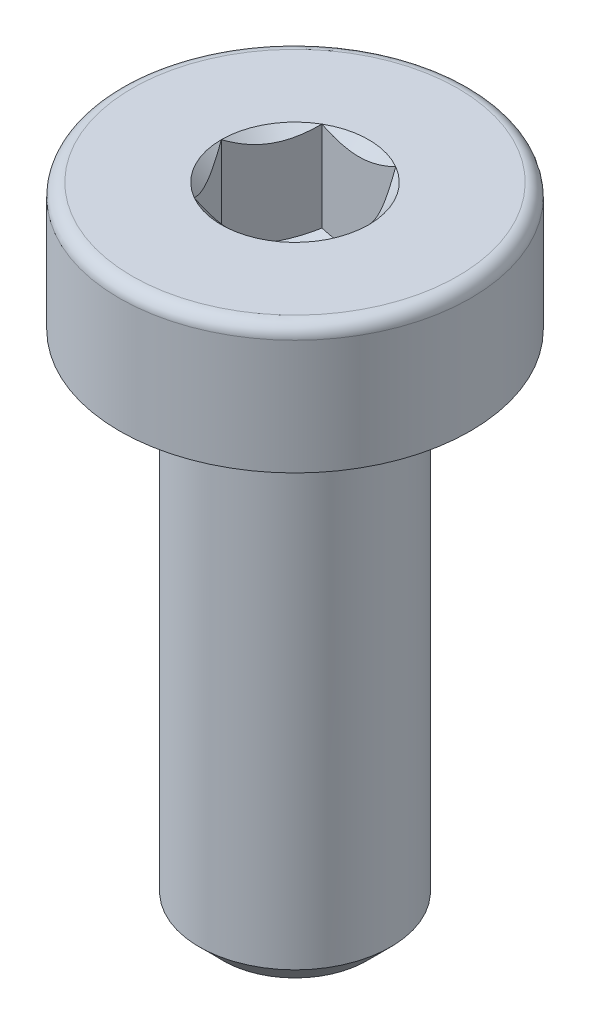
ISO-10303-21;
HEADER;
FILE_DESCRIPTION(('STEP AP214'),'2;1');
FILE_NAME('part.step','',(''),(''),'','','');
FILE_SCHEMA(('AUTOMOTIVE_DESIGN { 1 0 10303 214 1 1 1 1 }'));
ENDSEC;
DATA;
#1=APPLICATION_CONTEXT('core data for automotive mechanical design processes');
#2=APPLICATION_PROTOCOL_DEFINITION('international standard','automotive_design',2000,#1);
#3=PRODUCT_CONTEXT('',#1,'mechanical');
#4=PRODUCT('Part','Part','',(#3));
#5=PRODUCT_RELATED_PRODUCT_CATEGORY('part','',(#4));
#6=PRODUCT_DEFINITION_FORMATION('','',#4);
#7=PRODUCT_DEFINITION_CONTEXT('part definition',#1,'design');
#8=PRODUCT_DEFINITION('design','',#6,#7);
#9=PRODUCT_DEFINITION_SHAPE('','',#8);
#10=(LENGTH_UNIT() NAMED_UNIT(*) SI_UNIT(.MILLI.,.METRE.));
#11=(NAMED_UNIT(*) PLANE_ANGLE_UNIT() SI_UNIT($,.RADIAN.));
#12=(NAMED_UNIT(*) SI_UNIT($,.STERADIAN.) SOLID_ANGLE_UNIT());
#13=UNCERTAINTY_MEASURE_WITH_UNIT(LENGTH_MEASURE(1.E-05),#10,'distance_accuracy_value','');
#14=(GEOMETRIC_REPRESENTATION_CONTEXT(3) GLOBAL_UNCERTAINTY_ASSIGNED_CONTEXT((#13)) GLOBAL_UNIT_ASSIGNED_CONTEXT((#10,
#11,#12)) REPRESENTATION_CONTEXT('',''));
#15=CARTESIAN_POINT('',(0.,0.,0.));
#16=DIRECTION('',(0.,0.,1.));
#17=DIRECTION('',(1.,0.,0.));
#18=AXIS2_PLACEMENT_3D('',#15,#16,#17);
#19=CARTESIAN_POINT('',(0.,-0.2,0.));
#20=DIRECTION('',(0.,1.,0.));
#21=DIRECTION('',(0.,0.,-1.));
#22=AXIS2_PLACEMENT_3D('',#19,#20,#21);
#23=TOROIDAL_SURFACE('',#22,1.7,0.2);
#24=CARTESIAN_POINT('',(0.,0.,0.));
#25=DIRECTION('',(0.,-1.,0.));
#26=DIRECTION('',(0.,0.,-1.));
#27=AXIS2_PLACEMENT_3D('',#24,#25,#26);
#28=CIRCLE('',#27,1.7);
#29=CARTESIAN_POINT('',(0.,0.,-1.7));
#30=VERTEX_POINT('',#29);
#31=EDGE_CURVE('E127',#30,#30,#28,.T.);
#32=ORIENTED_EDGE('',*,*,#31,.T.);
#33=EDGE_LOOP('',(#32));
#34=FACE_BOUND('',#33,.T.);
#35=CARTESIAN_POINT('',(0.,-0.2,0.));
#36=DIRECTION('',(0.,1.,0.));
#37=DIRECTION('',(0.,0.,-1.));
#38=AXIS2_PLACEMENT_3D('',#35,#36,#37);
#39=CIRCLE('',#38,1.5);
#40=CARTESIAN_POINT('',(0.,-0.2,-1.5));
#41=VERTEX_POINT('',#40);
#42=EDGE_CURVE('E139',#41,#41,#39,.T.);
#43=ORIENTED_EDGE('',*,*,#42,.T.);
#44=EDGE_LOOP('',(#43));
#45=FACE_BOUND('',#44,.T.);
#46=ADVANCED_FACE('F41',(#34,#45),#23,.F.);
#47=CARTESIAN_POINT('',(0.,-8.,0.));
#48=DIRECTION('',(0.,1.,0.));
#49=DIRECTION('',(1.,0.,0.));
#50=AXIS2_PLACEMENT_3D('',#47,#48,#49);
#51=PLANE('',#50);
#52=CARTESIAN_POINT('',(0.,-8.,0.));
#53=DIRECTION('',(0.,1.,0.));
#54=DIRECTION('',(0.,0.,-1.));
#55=AXIS2_PLACEMENT_3D('',#52,#53,#54);
#56=CIRCLE('',#55,1.125);
#57=CARTESIAN_POINT('',(0.,-8.,-1.125));
#58=VERTEX_POINT('',#57);
#59=EDGE_CURVE('E11',#58,#58,#56,.T.);
#60=ORIENTED_EDGE('',*,*,#59,.F.);
#61=EDGE_LOOP('',(#60));
#62=FACE_BOUND('',#61,.T.);
#63=ADVANCED_FACE('F206',(#62),#51,.F.);
#64=CARTESIAN_POINT('',(0.,-8.125,0.));
#65=DIRECTION('',(0.,1.,0.));
#66=DIRECTION('',(-1.,0.,0.));
#67=AXIS2_PLACEMENT_3D('',#64,#65,#66);
#68=CONICAL_SURFACE('',#67,1.,0.785398163397448);
#69=ORIENTED_EDGE('',*,*,#59,.T.);
#70=EDGE_LOOP('',(#69));
#71=FACE_BOUND('',#70,.T.);
#72=CARTESIAN_POINT('',(0.,-7.625,0.));
#73=DIRECTION('',(0.,1.,0.));
#74=DIRECTION('',(-1.,0.,0.));
#75=AXIS2_PLACEMENT_3D('',#72,#73,#74);
#76=CIRCLE('',#75,1.5);
#77=CARTESIAN_POINT('',(-1.5,-7.625,0.));
#78=VERTEX_POINT('',#77);
#79=EDGE_CURVE('E142',#78,#78,#76,.T.);
#80=ORIENTED_EDGE('',*,*,#79,.F.);
#81=EDGE_LOOP('',(#80));
#82=FACE_BOUND('',#81,.T.);
#83=ADVANCED_FACE('F164',(#71,#82),#68,.T.);
#84=CARTESIAN_POINT('',(-1.15470053837925,0.5,0.));
#85=DIRECTION('',(-0.866025403784439,0.,-0.5));
#86=DIRECTION('',(0.,1.,0.));
#87=AXIS2_PLACEMENT_3D('',#84,#85,#86);
#88=PLANE('',#87);
#89=CARTESIAN_POINT('',(-1.15470053837925,2.,0.));
#90=CARTESIAN_POINT('',(-1.13811290051949,1.98342266199646,-0.0287348170953944));
#91=CARTESIAN_POINT('',(-1.12123555069305,1.96760439479917,-0.0577616138982867));
#92=CARTESIAN_POINT('',(-1.09593470093621,1.94579754194468,-0.101183953998303));
#93=CARTESIAN_POINT('',(-1.08770744910027,1.93899563963594,-0.115289976780325));
#94=CARTESIAN_POINT('',(-1.07137905760404,1.92611876946348,-0.143289328742409));
#95=CARTESIAN_POINT('',(-1.06328091933733,1.92002869586461,-0.157177412131507));
#96=CARTESIAN_POINT('',(-1.04720018701061,1.90857633773861,-0.184787164277924));
#97=CARTESIAN_POINT('',(-1.03921987610035,1.90319950581573,-0.198504111998951));
#98=CARTESIAN_POINT('',(-1.02335869013404,1.89317259824657,-0.225819419170297));
#99=CARTESIAN_POINT('',(-1.01547945146266,1.88850921181502,-0.239413822772958));
#100=CARTESIAN_POINT('',(-0.999798885932428,1.87990783588392,-0.266532275213475));
#101=CARTESIAN_POINT('',(-0.991998636338617,1.87595850190746,-0.280053335251351));
#102=CARTESIAN_POINT('',(-0.976448412405247,1.86878294697385,-0.307073372510779));
#103=CARTESIAN_POINT('',(-0.968699070566479,1.86554812543175,-0.320570421372709));
#104=CARTESIAN_POINT('',(-0.953216804871379,1.85979880306902,-0.347590357134202));
#105=CARTESIAN_POINT('',(-0.945484180860458,1.85727916970106,-0.361112320660297));
#106=CARTESIAN_POINT('',(-0.929993904585942,1.85295579242638,-0.388228510454098));
#107=CARTESIAN_POINT('',(-0.922236308144873,1.85115096744245,-0.401822595841889));
#108=CARTESIAN_POINT('',(-0.90665050966111,1.8482557150365,-0.429129644754855));
#109=CARTESIAN_POINT('',(-0.898822146976691,1.84716860492423,-0.442842867527506));
#110=CARTESIAN_POINT('',(-0.883030995902152,1.8456940799998,-0.470425755688464));
#111=CARTESIAN_POINT('',(-0.875067667178854,1.84531431420474,-0.484295517782133));
#112=CARTESIAN_POINT('',(-0.858942744760318,1.84528887087763,-0.51231125005588));
#113=CARTESIAN_POINT('',(-0.85078050857397,1.84565882739202,-0.52645688326507));
#114=CARTESIAN_POINT('',(-0.834496812685205,1.847210942197,-0.554713266474792));
#115=CARTESIAN_POINT('',(-0.826375327173013,1.84839249628394,-0.56882403459356));
#116=CARTESIAN_POINT('',(-0.810129363846157,1.85155142789717,-0.597074648783628));
#117=CARTESIAN_POINT('',(-0.802005196148906,1.85353382402747,-0.61121410805965));
#118=CARTESIAN_POINT('',(-0.785713974285288,1.85829144566636,-0.639587165283902));
#119=CARTESIAN_POINT('',(-0.777547766927851,1.86107677968836,-0.653819546505297));
#120=CARTESIAN_POINT('',(-0.761124224940597,1.86743549154836,-0.682436198086551));
#121=CARTESIAN_POINT('',(-0.752868210738168,1.87102315380283,-0.696818032238172));
#122=CARTESIAN_POINT('',(-0.736207806345465,1.87897968869029,-0.725784259598186));
#123=CARTESIAN_POINT('',(-0.727804874211313,1.88336586622526,-0.740364713591029));
#124=CARTESIAN_POINT('',(-0.711592080268563,1.8924866846744,-0.768416307208119));
#125=CARTESIAN_POINT('',(-0.703778742074904,1.89718094197276,-0.781898624581838));
#126=CARTESIAN_POINT('',(-0.688135072813054,1.90717702575227,-0.808872655482011));
#127=CARTESIAN_POINT('',(-0.680305730171417,1.91248565807263,-0.822362416598757));
#128=CARTESIAN_POINT('',(-0.664615689697741,1.92370585705,-0.84938935749767));
#129=CARTESIAN_POINT('',(-0.656756414542127,1.92962555083964,-0.862923982797114));
#130=CARTESIAN_POINT('',(-0.64099605532617,1.94206708289181,-0.890075839755966));
#131=CARTESIAN_POINT('',(-0.633096875640915,1.94859801630983,-0.903689987556145));
#132=CARTESIAN_POINT('',(-0.609052537896968,1.96932150291984,-0.945159941867087));
#133=CARTESIAN_POINT('',(-0.593083085982219,1.98426742536512,-0.972744659363466));
#134=CARTESIAN_POINT('',(-0.577350269189265,1.9999999999997,-0.999999999999873));
#135=B_SPLINE_CURVE_WITH_KNOTS('',3,(#89,#90,#91,#92,#93,#94,#95,#96,#97,#98,#99,#100,#101,#102,
#103,#104,#105,#106,#107,#108,#109,#110,#111,#112,#113,#114,#115,#116,#117,#118,#119,#120,#121,
#122,#123,#124,#125,#126,#127,#128,#129,#130,#131,#132,#133,#134),.UNSPECIFIED.,.F.,.F.,(4,2,2,
2,2,2,2,2,2,2,2,2,2,2,2,2,2,2,2,2,2,2,4),(0.,0.111272550174337,0.164335445361573,
0.215899595557141,0.266155171285321,0.315312848542686,0.363603421261408,0.411276511431237,
0.458598287135888,0.505848217490368,0.553315037999811,0.601292236029578,0.650280199235592,
0.699231732228985,0.748494907961426,0.798407597789335,0.849291872516503,0.90144968589758,
0.950262743745297,0.999680464451618,1.0498706012499,1.10098683352,1.20653128166088),.UNSPECIFIED.);
#136=CARTESIAN_POINT('',(-1.15470053837925,2.,0.));
#137=VERTEX_POINT('',#136);
#138=CARTESIAN_POINT('',(-0.577350269189626,2.,-1.));
#139=VERTEX_POINT('',#138);
#140=EDGE_CURVE('E130',#137,#139,#135,.T.);
#141=ORIENTED_EDGE('',*,*,#140,.F.);
#142=DIRECTION('',(0.,1.,0.));
#143=VECTOR('',#142,1.);
#144=CARTESIAN_POINT('',(-1.15470053837925,0.5,0.));
#145=LINE('',#144,#143);
#146=CARTESIAN_POINT('',(-1.15470053837925,0.589316397477044,0.));
#147=VERTEX_POINT('',#146);
#148=EDGE_CURVE('E53',#147,#137,#145,.T.);
#149=ORIENTED_EDGE('',*,*,#148,.F.);
#150=CARTESIAN_POINT('',(-1.15470053837925,0.589316397477044,0.));
#151=CARTESIAN_POINT('',(-0.866025403784419,0.422649730810363,-0.500000000000031));
#152=CARTESIAN_POINT('',(-0.577350269189623,0.589316397477023,-1.));
#153=B_SPLINE_CURVE_WITH_KNOTS('',2,(#150,#151,#152),.UNSPECIFIED.,.F.,.F.,(3,3),(0.,1.),.UNSPECIFIED.);
#154=CARTESIAN_POINT('',(-0.577350269189626,0.589316397477042,-1.));
#155=VERTEX_POINT('',#154);
#156=EDGE_CURVE('E240',#147,#155,#153,.T.);
#157=ORIENTED_EDGE('',*,*,#156,.T.);
#158=DIRECTION('',(0.,1.,0.));
#159=VECTOR('',#158,1.);
#160=CARTESIAN_POINT('',(-0.577350269189626,0.5,-1.));
#161=LINE('',#160,#159);
#162=EDGE_CURVE('E323',#155,#139,#161,.T.);
#163=ORIENTED_EDGE('',*,*,#162,.T.);
#164=EDGE_LOOP('',(#141,#149,#157,#163));
#165=FACE_BOUND('',#164,.T.);
#166=ADVANCED_FACE('F154',(#165),#88,.F.);
#167=CARTESIAN_POINT('',(-0.577350269189624,0.5,1.));
#168=DIRECTION('',(-0.866025403784438,0.,0.5));
#169=DIRECTION('',(-0.5,0.,-0.866025403784438));
#170=AXIS2_PLACEMENT_3D('',#167,#168,#169);
#171=PLANE('',#170);
#172=CARTESIAN_POINT('',(-0.577350269189628,2.00000000000001,1.));
#173=CARTESIAN_POINT('',(-0.593941531837459,1.98342266199647,0.971267275676974));
#174=CARTESIAN_POINT('',(-0.61064080034603,1.96760439479918,0.942137663577272));
#175=CARTESIAN_POINT('',(-0.635595225085994,1.94579754194469,0.898515314900514));
#176=CARTESIAN_POINT('',(-0.643697773243615,1.93899563963595,0.884337294416245));
#177=CARTESIAN_POINT('',(-0.659781727584165,1.92611876946349,0.856196816596529));
#178=CARTESIAN_POINT('',(-0.667760091475645,1.92002869586462,0.842239581439652));
#179=CARTESIAN_POINT('',(-0.683630472063271,1.90857633773862,0.814508382660042));
#180=CARTESIAN_POINT('',(-0.691519541796937,1.90319950581574,0.800738756821153));
#181=CARTESIAN_POINT('',(-0.70724469873634,1.89317259824658,0.773344913254501));
#182=CARTESIAN_POINT('',(-0.715078178269854,1.88850921181503,0.759724090601278));
#183=CARTESIAN_POINT('',(-0.730723164229545,1.87990783588393,0.732585096286131));
#184=CARTESIAN_POINT('',(-0.738532620911535,1.87595850190747,0.719069351963093));
#185=CARTESIAN_POINT('',(-0.754157547622717,1.86878294697386,0.692092444372544));
#186=CARTESIAN_POINT('',(-0.761971663893885,1.86554812543175,0.678632793046597));
#187=CARTESIAN_POINT('',(-0.77763048182441,1.85979880306903,0.651714789765753));
#188=CARTESIAN_POINT('',(-0.785474533741595,1.85727916970106,0.638257159171334));
#189=CARTESIAN_POINT('',(-0.80121270481961,1.85295579242638,0.611284091509063));
#190=CARTESIAN_POINT('',(-0.809106729886117,1.85115096744246,0.597768773224894));
#191=CARTESIAN_POINT('',(-0.824962428705249,1.84825571503651,0.570617551343206));
#192=CARTESIAN_POINT('',(-0.83292424665191,1.84716860492424,0.556981379002135));
#193=CARTESIAN_POINT('',(-0.848916152971775,1.84569407999981,0.529514396936106));
#194=CARTESIAN_POINT('',(-0.856946054927689,1.84531431420475,0.515683070916208));
#195=CARTESIAN_POINT('',(-0.873145929573069,1.84528887087764,0.487710612330905));
#196=CARTESIAN_POINT('',(-0.881315289191631,1.84565882739203,0.47356909183732));
#197=CARTESIAN_POINT('',(-0.897644186925879,1.84721094219701,0.445338805925414));
#198=CARTESIAN_POINT('',(-0.90580372782753,1.84839249628395,0.431250009096055));
#199=CARTESIAN_POINT('',(-0.922146495725198,1.85155142789717,0.403055285051083));
#200=CARTESIAN_POINT('',(-0.930329542805383,1.85353382402748,0.388949819802669));
#201=CARTESIAN_POINT('',(-0.946755720212819,1.85829144566637,0.360654679197969));
#202=CARTESIAN_POINT('',(-0.954998220228186,1.86107677968837,0.346466345563147));
#203=CARTESIAN_POINT('',(-0.971569196475207,1.86743549154837,0.31793481519138));
#204=CARTESIAN_POINT('',(-0.979896223102333,1.87102315380284,0.303593980082215));
#205=CARTESIAN_POINT('',(-0.996651509651594,1.8789796886903,0.274682532960673));
#206=CARTESIAN_POINT('',(-1.00507708714105,1.88336586622527,0.260115153269712));
#207=CARTESIAN_POINT('',(-1.02126408285868,1.89248668467436,0.232048665040395));
#208=CARTESIAN_POINT('',(-1.02903344310931,1.89718094197267,0.218540956989525));
#209=CARTESIAN_POINT('',(-1.04457180448032,1.90717702575211,0.191506126550374));
#210=CARTESIAN_POINT('',(-1.05233960897755,1.91248565807245,0.177980836369454));
#211=CARTESIAN_POINT('',(-1.06790060614572,1.92370585704978,0.150879392283449));
#212=CARTESIAN_POINT('',(-1.07569229790793,1.92962555083941,0.137305747693652));
#213=CARTESIAN_POINT('',(-1.09132631618625,1.94206708289158,0.11008094776045));
#214=CARTESIAN_POINT('',(-1.09916692418947,1.94859801630961,0.0964329835838638));
#215=CARTESIAN_POINT('',(-1.12305878924465,1.9693215029197,0.0548749991248427));
#216=CARTESIAN_POINT('',(-1.13896312939544,1.98426742536505,0.0272526893338586));
#217=CARTESIAN_POINT('',(-1.15470053837896,1.99999999999971,-2.5048082669767E-13));
#218=B_SPLINE_CURVE_WITH_KNOTS('',3,(#172,#173,#174,#175,#176,#177,#178,#179,#180,#181,#182,
#183,#184,#185,#186,#187,#188,#189,#190,#191,#192,#193,#194,#195,#196,#197,#198,#199,#200,#201,
#202,#203,#204,#205,#206,#207,#208,#209,#210,#211,#212,#213,#214,#215,#216,#217),.UNSPECIFIED.,
.F.,.F.,(4,2,2,2,2,2,2,2,2,2,2,2,2,2,2,2,2,2,2,2,2,2,4),(0.,0.111272550174332,0.164335445361567,
0.215899595557133,0.266155171285313,0.315312848542677,0.3636034212614,0.411276511431228,
0.45859828713588,0.505848217490361,0.553315037999805,0.601292236029574,0.65028019923533,
0.699231732228569,0.748494907960958,0.798407597788917,0.849291872516234,0.901449685897562,
0.950262743745008,0.999680464451159,1.04987060124937,1.10098683351952,1.20653128166087),.UNSPECIFIED.);
#219=CARTESIAN_POINT('',(-0.577350269189625,2.,1.));
#220=VERTEX_POINT('',#219);
#221=EDGE_CURVE('E364',#220,#137,#218,.T.);
#222=ORIENTED_EDGE('',*,*,#221,.F.);
#223=DIRECTION('',(0.,1.,0.));
#224=VECTOR('',#223,1.);
#225=CARTESIAN_POINT('',(-0.577350269189625,0.5,1.));
#226=LINE('',#225,#224);
#227=CARTESIAN_POINT('',(-0.577350269189625,0.589316397477047,1.));
#228=VERTEX_POINT('',#227);
#229=EDGE_CURVE('E374',#228,#220,#226,.T.);
#230=ORIENTED_EDGE('',*,*,#229,.F.);
#231=CARTESIAN_POINT('',(-0.577350269189624,0.589316397477046,1.));
#232=CARTESIAN_POINT('',(-0.866025403784455,0.422649730810367,0.499999999999969));
#233=CARTESIAN_POINT('',(-1.15470053837925,0.589316397477025,0.));
#234=B_SPLINE_CURVE_WITH_KNOTS('',2,(#231,#232,#233),.UNSPECIFIED.,.F.,.F.,(3,3),(0.,1.),.UNSPECIFIED.);
#235=EDGE_CURVE('E187',#228,#147,#234,.T.);
#236=ORIENTED_EDGE('',*,*,#235,.T.);
#237=ORIENTED_EDGE('',*,*,#148,.T.);
#238=EDGE_LOOP('',(#222,#230,#236,#237));
#239=FACE_BOUND('',#238,.T.);
#240=ADVANCED_FACE('F163',(#239),#171,.F.);
#241=CARTESIAN_POINT('',(0.577350269189628,0.5,1.));
#242=DIRECTION('',(0.,0.,1.));
#243=DIRECTION('',(0.,-1.,0.));
#244=AXIS2_PLACEMENT_3D('',#241,#242,#243);
#245=PLANE('',#244);
#246=CARTESIAN_POINT('',(0.577350269189624,2.00000000000001,1.));
#247=CARTESIAN_POINT('',(0.553800025915533,1.98822603681754,0.999998167957607));
#248=CARTESIAN_POINT('',(0.53002319662689,1.97688905054343,1.00001417378921));
#249=CARTESIAN_POINT('',(0.482781582166339,1.9556075877741,1.00006888120379));
#250=CARTESIAN_POINT('',(0.459331734859619,1.94562984801314,1.00010682894213));
#251=CARTESIAN_POINT('',(0.412637184989049,1.92706153398431,1.00019267101419));
#252=CARTESIAN_POINT('',(0.389404800641485,1.91844018503403,1.00024026062339));
#253=CARTESIAN_POINT('',(0.343025384343104,1.90258770334269,1.00032811834732));
#254=CARTESIAN_POINT('',(0.319887287423713,1.89533063168831,1.0003685220543));
#255=CARTESIAN_POINT('',(0.28396905815587,1.88513189438625,1.00037952108944));
#256=CARTESIAN_POINT('',(0.271315561221434,1.88173971858613,1.00037366472534));
#257=CARTESIAN_POINT('',(0.246157653172697,1.87541237483904,1.00034209137255));
#258=CARTESIAN_POINT('',(0.233655177580738,1.87246955581885,1.00031676570706));
#259=CARTESIAN_POINT('',(0.208770103174207,1.86704337026022,1.00026027717205));
#260=CARTESIAN_POINT('',(0.196389006729885,1.86455313042386,1.0002292192388));
#261=CARTESIAN_POINT('',(0.171716988877537,1.86003037325887,1.00016856051116));
#262=CARTESIAN_POINT('',(0.159427126425281,1.85799209889465,1.00013894565578));
#263=CARTESIAN_POINT('',(0.134906807402543,1.85437228307887,1.00008682181391));
#264=CARTESIAN_POINT('',(0.122677002769373,1.85278634040735,1.00006424413959));
#265=CARTESIAN_POINT('',(0.0982452716357383,1.85006970506283,1.00002877386777));
#266=CARTESIAN_POINT('',(0.0860436599187247,1.84893619003586,1.00001582077837));
#267=CARTESIAN_POINT('',(0.0616361034369748,1.84712271030556,0.999999281194874));
#268=CARTESIAN_POINT('',(0.049430239160526,1.84644166498135,0.99999567232403));
#269=CARTESIAN_POINT('',(0.0249814925742225,1.84553156126019,0.999994826477444));
#270=CARTESIAN_POINT('',(0.0127385824285995,1.84530325235072,0.999997600051223));
#271=CARTESIAN_POINT('',(-0.0117699093089312,1.84529590976491,1.00000240436833));
#272=CARTESIAN_POINT('',(-0.0240354911326579,1.84551770421206,1.00000443373431));
#273=CARTESIAN_POINT('',(-0.0485276608234832,1.84641485939752,1.00001329857417));
#274=CARTESIAN_POINT('',(-0.0607542789969373,1.84708939120195,1.00002012526552));
#275=CARTESIAN_POINT('',(-0.0852014626157827,1.84889040013758,1.00004221085803));
#276=CARTESIAN_POINT('',(-0.0974219540555072,1.8500178795742,1.00005748848831));
#277=CARTESIAN_POINT('',(-0.121889608631145,1.8527228717761,1.00009680071916));
#278=CARTESIAN_POINT('',(-0.13413646702124,1.85430313264586,1.00012088904999));
#279=CARTESIAN_POINT('',(-0.158689106182079,1.85791203563793,1.00017544918413));
#280=CARTESIAN_POINT('',(-0.170994247777745,1.85994501185442,1.00020598253097));
#281=CARTESIAN_POINT('',(-0.195695079239052,1.864457628014,1.00026809188207));
#282=CARTESIAN_POINT('',(-0.208089724420771,1.86694296685528,1.00029967641919));
#283=CARTESIAN_POINT('',(-0.233000226311658,1.87235971612185,1.00035691387752));
#284=CARTESIAN_POINT('',(-0.24551459573445,1.87529795011875,1.00038245763407));
#285=CARTESIAN_POINT('',(-0.270694579941495,1.88161679535159,1.00041468917582));
#286=CARTESIAN_POINT('',(-0.283358271723342,1.88500502464959,1.00042099293427));
#287=CARTESIAN_POINT('',(-0.319355980941363,1.89520675220563,1.00040981931455));
#288=CARTESIAN_POINT('',(-0.342562828838121,1.9024735224621,1.00036742345573));
#289=CARTESIAN_POINT('',(-0.389067231423858,1.91834639861325,1.00027227006806));
#290=CARTESIAN_POINT('',(-0.412356054143943,1.92697788991275,1.00021930978689));
#291=CARTESIAN_POINT('',(-0.459150817788463,1.94556797492265,1.00012281198921));
#292=CARTESIAN_POINT('',(-0.482644619058579,1.95555692973842,1.00007957938085));
#293=CARTESIAN_POINT('',(-0.529961603825126,1.97686192522768,1.00001682251946));
#294=CARTESIAN_POINT('',(-0.553769993135023,1.98821092489576,0.999998129439885));
#295=CARTESIAN_POINT('',(-0.577350269189629,2.,0.99999999999999));
#296=B_SPLINE_CURVE_WITH_KNOTS('',3,(#246,#247,#248,#249,#250,#251,#252,#253,#254,#255,#256,
#257,#258,#259,#260,#261,#262,#263,#264,#265,#266,#267,#268,#269,#270,#271,#272,#273,#274,#275,
#276,#277,#278,#279,#280,#281,#282,#283,#284,#285,#286,#287,#288,#289,#290,#291,#292,#293,#294,
#295),.UNSPECIFIED.,.F.,.F.,(4,2,2,2,2,2,2,2,2,2,2,2,2,2,2,2,2,2,2,2,2,2,2,2,4),(0.,
0.0789945069839851,0.155423933765288,0.229735714121901,0.302447276968801,0.341742966594387,
0.380268841749468,0.418149076076723,0.455514857491566,0.492503591404803,0.52925783231042,
0.565923975475662,0.602650767505618,0.639445192650885,0.676172432608918,0.712981396109526,
0.75001867970216,0.787427074463517,0.825344251186806,0.863901683628061,0.903223842479998,
0.976140734734358,1.05062170245461,1.12718543062468,1.20628071173709),.UNSPECIFIED.);
#297=CARTESIAN_POINT('',(0.577350269189628,2.,1.));
#298=VERTEX_POINT('',#297);
#299=EDGE_CURVE('E435',#298,#220,#296,.T.);
#300=ORIENTED_EDGE('',*,*,#299,.F.);
#301=DIRECTION('',(0.,1.,0.));
#302=VECTOR('',#301,1.);
#303=CARTESIAN_POINT('',(0.577350269189628,0.5,1.));
#304=LINE('',#303,#302);
#305=CARTESIAN_POINT('',(0.577350269189628,0.589316397477047,1.));
#306=VERTEX_POINT('',#305);
#307=EDGE_CURVE('E322',#306,#298,#304,.T.);
#308=ORIENTED_EDGE('',*,*,#307,.F.);
#309=CARTESIAN_POINT('',(0.577350269189629,0.589316397477046,1.));
#310=CARTESIAN_POINT('',(0.,0.422649730810369,1.));
#311=CARTESIAN_POINT('',(-0.577350269189626,0.589316397477027,1.));
#312=B_SPLINE_CURVE_WITH_KNOTS('',2,(#309,#310,#311),.UNSPECIFIED.,.F.,.F.,(3,3),(0.,1.),.UNSPECIFIED.);
#313=EDGE_CURVE('E615',#306,#228,#312,.T.);
#314=ORIENTED_EDGE('',*,*,#313,.T.);
#315=ORIENTED_EDGE('',*,*,#229,.T.);
#316=EDGE_LOOP('',(#300,#308,#314,#315));
#317=FACE_BOUND('',#316,.T.);
#318=ADVANCED_FACE('F258',(#317),#245,.F.);
#319=CARTESIAN_POINT('',(1.15470053837925,0.5,0.));
#320=DIRECTION('',(0.866025403784439,0.,0.5));
#321=DIRECTION('',(0.,-1.,0.));
#322=AXIS2_PLACEMENT_3D('',#319,#320,#321);
#323=PLANE('',#322);
#324=CARTESIAN_POINT('',(1.15470053837925,2.,0.));
#325=CARTESIAN_POINT('',(1.13811290051954,1.98342266199651,0.0287348170953168));
#326=CARTESIAN_POINT('',(1.12123555069315,1.96760439479927,0.0577616138981319));
#327=CARTESIAN_POINT('',(1.0959347009364,1.94579754194485,0.101183953998051));
#328=CARTESIAN_POINT('',(1.08770744910049,1.93899563963613,0.11528997678005));
#329=CARTESIAN_POINT('',(1.0713790576043,1.9261187694637,0.1432893287421));
#330=CARTESIAN_POINT('',(1.06328091933761,1.92002869586484,0.157177412131185));
#331=CARTESIAN_POINT('',(1.04720018701092,1.90857633773886,0.184787164277586));
#332=CARTESIAN_POINT('',(1.03921987610068,1.90319950581599,0.198504111998609));
#333=CARTESIAN_POINT('',(1.02335869013438,1.89317259824684,0.225819419169955));
#334=CARTESIAN_POINT('',(1.01547945146302,1.8885092118153,0.239413822772619));
#335=CARTESIAN_POINT('',(0.999798885932792,1.87990783588419,0.26653227521315));
#336=CARTESIAN_POINT('',(0.991998636338982,1.87595850190773,0.280053335251036));
#337=CARTESIAN_POINT('',(0.976448412405607,1.86878294697411,0.307073372510489));
#338=CARTESIAN_POINT('',(0.968699070566833,1.865548125432,0.320570421372434));
#339=CARTESIAN_POINT('',(0.953216804871711,1.85979880306925,0.34759035713396));
#340=CARTESIAN_POINT('',(0.945484180860775,1.85727916970128,0.361112320660075));
#341=CARTESIAN_POINT('',(0.929993904586221,1.85295579242657,0.388228510453917));
#342=CARTESIAN_POINT('',(0.922236308145128,1.85115096744263,0.401822595841729));
#343=CARTESIAN_POINT('',(0.90665050966131,1.84825571503663,0.429129644754741));
#344=CARTESIAN_POINT('',(0.898822146976858,1.84716860492434,0.442842867527415));
#345=CARTESIAN_POINT('',(0.883030995902241,1.84569407999986,0.470425755688419));
#346=CARTESIAN_POINT('',(0.875067667178897,1.84531431420477,0.48429551778211));
#347=CARTESIAN_POINT('',(0.858942744760382,1.84528887087762,0.512311250055722));
#348=CARTESIAN_POINT('',(0.850780508574103,1.84565882739198,0.526456883264756));
#349=CARTESIAN_POINT('',(0.834496812685462,1.84721094219691,0.554713266474235));
#350=CARTESIAN_POINT('',(0.826375327173327,1.84839249628385,0.568824034592915));
#351=CARTESIAN_POINT('',(0.810129363846558,1.85155142789705,0.597074648782873));
#352=CARTESIAN_POINT('',(0.802005196149339,1.85353382402735,0.611214108058871));
#353=CARTESIAN_POINT('',(0.785713974285749,1.85829144566624,0.639587165283134));
#354=CARTESIAN_POINT('',(0.777547766928309,1.86107677968825,0.653819546504565));
#355=CARTESIAN_POINT('',(0.761124224941007,1.86743549154827,0.682436198085945));
#356=CARTESIAN_POINT('',(0.752868210738532,1.87102315380276,0.696818032237658));
#357=CARTESIAN_POINT('',(0.73620780634568,1.87897968869026,0.725784259597905));
#358=CARTESIAN_POINT('',(0.727804874211422,1.88336586622525,0.74036471359089));
#359=CARTESIAN_POINT('',(0.711592080268588,1.89248668467437,0.768416307208036));
#360=CARTESIAN_POINT('',(0.703778742074949,1.89718094197268,0.781898624581674));
#361=CARTESIAN_POINT('',(0.688135072813142,1.90717702575212,0.808872655481718));
#362=CARTESIAN_POINT('',(0.680305730171529,1.91248565807245,0.822362416598417));
#363=CARTESIAN_POINT('',(0.664615689697889,1.92370585704979,0.849389357497269));
#364=CARTESIAN_POINT('',(0.656756414542289,1.92962555083942,0.862923982796697));
#365=CARTESIAN_POINT('',(0.640996055326348,1.94206708289159,0.890075839755551));
#366=CARTESIAN_POINT('',(0.633096875641094,1.94859801630962,0.903689987555748));
#367=CARTESIAN_POINT('',(0.609052537897095,1.96932150291971,0.945159941866839));
#368=CARTESIAN_POINT('',(0.593083085982296,1.98426742536507,0.972744659363348));
#369=CARTESIAN_POINT('',(0.577350269189271,1.99999999999972,0.999999999999876));
#370=B_SPLINE_CURVE_WITH_KNOTS('',3,(#324,#325,#326,#327,#328,#329,#330,#331,#332,#333,#334,
#335,#336,#337,#338,#339,#340,#341,#342,#343,#344,#345,#346,#347,#348,#349,#350,#351,#352,#353,
#354,#355,#356,#357,#358,#359,#360,#361,#362,#363,#364,#365,#366,#367,#368,#369),.UNSPECIFIED.,
.F.,.F.,(4,2,2,2,2,2,2,2,2,2,2,2,2,2,2,2,2,2,2,2,2,2,4),(0.,0.111272550174011,0.16433544536114,
0.215899595556638,0.266155171284781,0.315312848542141,0.363603421260888,0.411276511430768,
0.458598287135496,0.505848217490074,0.553315037999631,0.601292236029526,0.650280199235029,
0.699231732228109,0.74849490796044,0.798407597788447,0.849291872515925,0.901449685897527,
0.950262743744969,0.999680464451117,1.04987060124933,1.10098683351948,1.20653128166083),.UNSPECIFIED.);
#371=CARTESIAN_POINT('',(1.15470053837925,2.,0.));
#372=VERTEX_POINT('',#371);
#373=EDGE_CURVE('E329',#372,#298,#370,.T.);
#374=ORIENTED_EDGE('',*,*,#373,.F.);
#375=DIRECTION('',(0.,1.,0.));
#376=VECTOR('',#375,1.);
#377=CARTESIAN_POINT('',(1.15470053837925,0.5,0.));
#378=LINE('',#377,#376);
#379=CARTESIAN_POINT('',(1.15470053837925,0.589316397477045,0.));
#380=VERTEX_POINT('',#379);
#381=EDGE_CURVE('E315',#380,#372,#378,.T.);
#382=ORIENTED_EDGE('',*,*,#381,.F.);
#383=CARTESIAN_POINT('',(1.15470053837925,0.589316397477044,0.));
#384=CARTESIAN_POINT('',(0.866025403784422,0.422649730810369,0.500000000000028));
#385=CARTESIAN_POINT('',(0.577350269189625,0.589316397477027,1.));
#386=B_SPLINE_CURVE_WITH_KNOTS('',2,(#383,#384,#385),.UNSPECIFIED.,.F.,.F.,(3,3),(0.,1.),.UNSPECIFIED.);
#387=EDGE_CURVE('E492',#380,#306,#386,.T.);
#388=ORIENTED_EDGE('',*,*,#387,.T.);
#389=ORIENTED_EDGE('',*,*,#307,.T.);
#390=EDGE_LOOP('',(#374,#382,#388,#389));
#391=FACE_BOUND('',#390,.T.);
#392=ADVANCED_FACE('F475',(#391),#323,.F.);
#393=CARTESIAN_POINT('',(0.577350269189626,0.5,-1.));
#394=DIRECTION('',(0.866025403784439,0.,-0.5));
#395=DIRECTION('',(0.,-1.,0.));
#396=AXIS2_PLACEMENT_3D('',#393,#394,#395);
#397=PLANE('',#396);
#398=CARTESIAN_POINT('',(0.577350269189624,1.99999999999999,-0.999999999999998));
#399=CARTESIAN_POINT('',(0.593941531837408,1.9834226619965,-0.971267275677055));
#400=CARTESIAN_POINT('',(0.610640800345942,1.96760439479926,-0.94213766357744));
#401=CARTESIAN_POINT('',(0.635595225085866,1.94579754194484,-0.898515314900803));
#402=CARTESIAN_POINT('',(0.64369777324348,1.93899563963612,-0.884337294416566));
#403=CARTESIAN_POINT('',(0.659781727584023,1.92611876946369,-0.856196816596903));
#404=CARTESIAN_POINT('',(0.667760091475502,1.92002869586483,-0.842239581440049));
#405=CARTESIAN_POINT('',(0.683630472063132,1.90857633773885,-0.814508382660476));
#406=CARTESIAN_POINT('',(0.691519541796802,1.90319950581598,-0.800738756821601));
#407=CARTESIAN_POINT('',(0.707244698736216,1.89317259824683,-0.773344913254968));
#408=CARTESIAN_POINT('',(0.715078178269738,1.88850921181529,-0.75972409060175));
#409=CARTESIAN_POINT('',(0.730723164229445,1.87990783588418,-0.732585096286604));
#410=CARTESIAN_POINT('',(0.738532620911444,1.87595850190772,-0.719069351963562));
#411=CARTESIAN_POINT('',(0.754157547622645,1.8687829469741,-0.692092444372996));
#412=CARTESIAN_POINT('',(0.761971663893822,1.86554812543199,-0.678632793047035));
#413=CARTESIAN_POINT('',(0.777630481824367,1.85979880306924,-0.651714789766157));
#414=CARTESIAN_POINT('',(0.785474533741561,1.85727916970127,-0.638257159171715));
#415=CARTESIAN_POINT('',(0.801212704819592,1.85295579242656,-0.611284091509391));
#416=CARTESIAN_POINT('',(0.809106729886106,1.85115096744262,-0.59776877322519));
#417=CARTESIAN_POINT('',(0.824962428705249,1.84825571503662,-0.570617551343432));
#418=CARTESIAN_POINT('',(0.832924246651914,1.84716860492433,-0.556981379002321));
#419=CARTESIAN_POINT('',(0.848916152971781,1.84569407999985,-0.529514396936204));
#420=CARTESIAN_POINT('',(0.856946054927693,1.84531431420477,-0.515683070916256));
#421=CARTESIAN_POINT('',(0.873145929573076,1.8452888708776,-0.487710612330836));
#422=CARTESIAN_POINT('',(0.881315289191643,1.84565882739196,-0.473569091837184));
#423=CARTESIAN_POINT('',(0.897644186925894,1.8472109421969,-0.445338805925169));
#424=CARTESIAN_POINT('',(0.905803727827543,1.84839249628383,-0.431250009095768));
#425=CARTESIAN_POINT('',(0.922146495725204,1.85155142789704,-0.403055285050741));
#426=CARTESIAN_POINT('',(0.930329542805384,1.85353382402733,-0.388949819802311));
#427=CARTESIAN_POINT('',(0.946755720212809,1.85829144566623,-0.360654679197609));
#428=CARTESIAN_POINT('',(0.954998220228171,1.86107677968823,-0.3464663455628));
#429=CARTESIAN_POINT('',(0.971569196475185,1.86743549154826,-0.317934815191085));
#430=CARTESIAN_POINT('',(0.979896223102309,1.87102315380274,-0.303593980081958));
#431=CARTESIAN_POINT('',(0.996651509651577,1.87897968869024,-0.274682532960527));
#432=CARTESIAN_POINT('',(1.00507708714105,1.88336586622524,-0.260115153269637));
#433=CARTESIAN_POINT('',(1.02126408285878,1.89248668467443,-0.232048665040293));
#434=CARTESIAN_POINT('',(1.02903344310952,1.89718094197282,-0.218540956989325));
#435=CARTESIAN_POINT('',(1.04457180448067,1.90717702575239,-0.191506126550005));
#436=CARTESIAN_POINT('',(1.05233960897795,1.91248565807276,-0.177980836369012));
#437=CARTESIAN_POINT('',(1.06790060614618,1.92370585705016,-0.150879392282903));
#438=CARTESIAN_POINT('',(1.0756922979084,1.9296255508398,-0.137305747693075));
#439=CARTESIAN_POINT('',(1.0913263161867,1.94206708289197,-0.110080947759855));
#440=CARTESIAN_POINT('',(1.0991669241899,1.94859801630999,-0.0964329835832811));
#441=CARTESIAN_POINT('',(1.12305878924491,1.96932150291994,-0.0548749991244581));
#442=CARTESIAN_POINT('',(1.13896312939556,1.98426742536517,-0.027252689333654));
#443=CARTESIAN_POINT('',(1.15470053837897,1.99999999999972,2.51310661974698E-13));
#444=B_SPLINE_CURVE_WITH_KNOTS('',3,(#398,#399,#400,#401,#402,#403,#404,#405,#406,#407,#408,
#409,#410,#411,#412,#413,#414,#415,#416,#417,#418,#419,#420,#421,#422,#423,#424,#425,#426,#427,
#428,#429,#430,#431,#432,#433,#434,#435,#436,#437,#438,#439,#440,#441,#442,#443),.UNSPECIFIED.,
.F.,.F.,(4,2,2,2,2,2,2,2,2,2,2,2,2,2,2,2,2,2,2,2,2,2,4),(0.,0.111272550174011,0.164335445361141,
0.215899595556638,0.266155171284782,0.315312848542142,0.363603421260889,0.411276511430769,
0.458598287135497,0.505848217490076,0.553315037999634,0.601292236029529,0.650280199235466,
0.699231732228805,0.748494907961222,0.798407597789143,0.849291872516367,0.901449685897551,
0.950262743745452,0.999680464451892,1.04987060125021,1.10098683352028,1.20653128166085),.UNSPECIFIED.);
#445=CARTESIAN_POINT('',(0.577350269189626,2.,-1.));
#446=VERTEX_POINT('',#445);
#447=EDGE_CURVE('E330',#446,#372,#444,.T.);
#448=ORIENTED_EDGE('',*,*,#447,.F.);
#449=DIRECTION('',(0.,1.,0.));
#450=VECTOR('',#449,1.);
#451=CARTESIAN_POINT('',(0.577350269189626,0.5,-1.));
#452=LINE('',#451,#450);
#453=CARTESIAN_POINT('',(0.577350269189626,0.589316397477042,-1.));
#454=VERTEX_POINT('',#453);
#455=EDGE_CURVE('E348',#454,#446,#452,.T.);
#456=ORIENTED_EDGE('',*,*,#455,.F.);
#457=CARTESIAN_POINT('',(0.577350269189626,0.589316397477041,-1.));
#458=CARTESIAN_POINT('',(0.866025403784456,0.422649730810364,-0.49999999999997));
#459=CARTESIAN_POINT('',(1.15470053837925,0.589316397477026,0.));
#460=B_SPLINE_CURVE_WITH_KNOTS('',2,(#457,#458,#459),.UNSPECIFIED.,.F.,.F.,(3,3),(0.,1.),.UNSPECIFIED.);
#461=EDGE_CURVE('E104',#454,#380,#460,.T.);
#462=ORIENTED_EDGE('',*,*,#461,.T.);
#463=ORIENTED_EDGE('',*,*,#381,.T.);
#464=EDGE_LOOP('',(#448,#456,#462,#463));
#465=FACE_BOUND('',#464,.T.);
#466=ADVANCED_FACE('F255',(#465),#397,.F.);
#467=CARTESIAN_POINT('',(-0.577350269189626,0.5,-1.));
#468=DIRECTION('',(0.,0.,-1.));
#469=DIRECTION('',(1.,0.,0.));
#470=AXIS2_PLACEMENT_3D('',#467,#468,#469);
#471=PLANE('',#470);
#472=CARTESIAN_POINT('',(-0.57735026918963,2.,-1.));
#473=CARTESIAN_POINT('',(-0.553799018626332,1.98822553857165,-0.999998173354036));
#474=CARTESIAN_POINT('',(-0.530021163519476,1.97688806823107,-1.00001416004713));
#475=CARTESIAN_POINT('',(-0.482777645672904,1.95560580828222,-1.00006882217097));
#476=CARTESIAN_POINT('',(-0.459326924867017,1.94562774621228,-1.00010674385478));
#477=CARTESIAN_POINT('',(-0.41263076310741,1.92705897163753,-1.00019256426333));
#478=CARTESIAN_POINT('',(-0.38939764378498,1.91843747465112,-1.00024015736838));
#479=CARTESIAN_POINT('',(-0.342950204797468,1.90256203937554,-1.00032813390887));
#480=CARTESIAN_POINT('',(-0.319743655589981,1.89528554551412,-1.00036863550711));
#481=CARTESIAN_POINT('',(-0.28379128714849,1.88508381221227,-1.0003795906038));
#482=CARTESIAN_POINT('',(-0.271173414160845,1.88170303933697,-1.00037378374481));
#483=CARTESIAN_POINT('',(-0.246085560922053,1.87539592858828,-1.00034249941035));
#484=CARTESIAN_POINT('',(-0.233617496928954,1.87246201269112,-1.00031740784827));
#485=CARTESIAN_POINT('',(-0.208764412875414,1.86704320231722,-1.00026132520407));
#486=CARTESIAN_POINT('',(-0.19638062679567,1.86455266223854,-1.00023042045424));
#487=CARTESIAN_POINT('',(-0.171702966320913,1.86002941476161,-1.00017003093781));
#488=CARTESIAN_POINT('',(-0.15941014937153,1.85799095773679,-1.00014053259975));
#489=CARTESIAN_POINT('',(-0.134883643999216,1.85437088523129,-1.00008857478594));
#490=CARTESIAN_POINT('',(-0.122650606079548,1.85278487744366,-1.00006604744148));
#491=CARTESIAN_POINT('',(-0.0982121229287101,1.85006821158009,-1.00003057238562));
#492=CARTESIAN_POINT('',(-0.0860069912288732,1.84893474144217,-1.00001756508196));
#493=CARTESIAN_POINT('',(-0.0615206333559041,1.84711617328081,-1.00000075780238));
#494=CARTESIAN_POINT('',(-0.0492392901357822,1.84643264686591,-0.999996989975494));
#495=CARTESIAN_POINT('',(-0.0246386324751404,1.84552292104013,-0.999995628044652));
#496=CARTESIAN_POINT('',(-0.012319289032145,1.84529750750861,-0.999998044533703));
#497=CARTESIAN_POINT('',(0.0121891761432831,1.84530155985422,-1.00000209957335));
#498=CARTESIAN_POINT('',(0.0243782990189907,1.845526246567,-1.00000374607075));
#499=CARTESIAN_POINT('',(0.0487185070377809,1.84642380416033,-1.00001205209129));
#500=CARTESIAN_POINT('',(0.0608696213382497,1.84709588263677,-1.00001870275395));
#501=CARTESIAN_POINT('',(0.0852380225508613,1.848891850074,-1.00004050720725));
#502=CARTESIAN_POINT('',(0.0974550405850347,1.85001938024755,-1.00005572992515));
#503=CARTESIAN_POINT('',(0.121916028787175,1.85272435329628,-1.00009503372606));
#504=CARTESIAN_POINT('',(0.13415969299641,1.85430455429515,-1.00011916938457));
#505=CARTESIAN_POINT('',(0.158706216430161,1.85791321080521,-1.00017388808731));
#506=CARTESIAN_POINT('',(0.171008435091418,1.85994600906713,-1.00020453345274));
#507=CARTESIAN_POINT('',(0.195703679393572,1.86445814400752,-1.00026690229582));
#508=CARTESIAN_POINT('',(0.20809565889068,1.86694318675753,-1.00029863477332));
#509=CARTESIAN_POINT('',(0.233038212021836,1.87236730255237,-1.00035626972392));
#510=CARTESIAN_POINT('',(0.24558702968548,1.8753144316261,-1.00038204351512));
#511=CARTESIAN_POINT('',(0.270837130755103,1.88165350290157,-1.00041455700835));
#512=CARTESIAN_POINT('',(0.283536471910628,1.88505313626283,-1.00042090732892));
#513=CARTESIAN_POINT('',(0.319499881149073,1.89525184723143,-1.00040967732382));
#514=CARTESIAN_POINT('',(0.342638089596974,1.90249917243223,-1.00036738779502));
#515=CARTESIAN_POINT('',(0.389074303524819,1.91834907543261,-1.00027237272484));
#516=CARTESIAN_POINT('',(0.412362412542345,1.92698042722443,-1.00021941755009));
#517=CARTESIAN_POINT('',(0.459155597441506,1.94557006531457,-1.00012289938572));
#518=CARTESIAN_POINT('',(0.482648537268387,1.95555870247411,-1.00007964036235));
#519=CARTESIAN_POINT('',(0.529963632723351,1.9768629062393,-1.00001683713881));
#520=CARTESIAN_POINT('',(0.553770998426698,1.9882114222119,-0.9999981241633));
#521=CARTESIAN_POINT('',(0.577350269189634,1.99999999999999,-0.99999999999999));
#522=B_SPLINE_CURVE_WITH_KNOTS('',3,(#472,#473,#474,#475,#476,#477,#478,#479,#480,#481,#482,
#483,#484,#485,#486,#487,#488,#489,#490,#491,#492,#493,#494,#495,#496,#497,#498,#499,#500,#501,
#502,#503,#504,#505,#506,#507,#508,#509,#510,#511,#512,#513,#514,#515,#516,#517,#518,#519,#520,
#521),.UNSPECIFIED.,.F.,.F.,(4,2,2,2,2,2,2,2,2,2,2,2,2,2,2,2,2,2,2,2,2,2,2,2,4),(0.,
0.0789978972695773,0.15543010410763,0.229744134366991,0.30266870017871,0.341852354194089,
0.380271674271243,0.418159989059979,0.45553460042943,0.492532973314776,0.529297720399875,
0.56619021112632,0.603145936609836,0.639711346045882,0.676212163855028,0.713010761266896,
0.750038523627865,0.787438183603003,0.825347352327571,0.86401143959863,0.903445706239183,
0.97614903621833,1.05062782272799,1.12718880955699,1.20628070690683),.UNSPECIFIED.);
#523=EDGE_CURVE('E276',#139,#446,#522,.T.);
#524=ORIENTED_EDGE('',*,*,#523,.F.);
#525=ORIENTED_EDGE('',*,*,#162,.F.);
#526=CARTESIAN_POINT('',(-0.577350269189627,0.589316397477041,-1.));
#527=CARTESIAN_POINT('',(0.,0.422649730810363,-1.));
#528=CARTESIAN_POINT('',(0.577350269189628,0.589316397477022,-1.));
#529=B_SPLINE_CURVE_WITH_KNOTS('',2,(#526,#527,#528),.UNSPECIFIED.,.F.,.F.,(3,3),(0.,1.),.UNSPECIFIED.);
#530=EDGE_CURVE('E96',#155,#454,#529,.T.);
#531=ORIENTED_EDGE('',*,*,#530,.T.);
#532=ORIENTED_EDGE('',*,*,#455,.T.);
#533=EDGE_LOOP('',(#524,#525,#531,#532));
#534=FACE_BOUND('',#533,.T.);
#535=ADVANCED_FACE('F244',(#534),#471,.F.);
#536=CARTESIAN_POINT('',(0.,2.,0.));
#537=DIRECTION('',(0.,1.,0.));
#538=DIRECTION('',(0.,0.,-1.));
#539=AXIS2_PLACEMENT_3D('',#536,#537,#538);
#540=CONICAL_SURFACE('',#539,1.15470053837925,0.785398163397448);
#541=ORIENTED_EDGE('',*,*,#140,.T.);
#542=CARTESIAN_POINT('',(0.,2.,0.));
#543=DIRECTION('',(0.,1.,0.));
#544=DIRECTION('',(-1.,0.,0.));
#545=AXIS2_PLACEMENT_3D('',#542,#543,#544);
#546=CIRCLE('',#545,1.15470053837925);
#547=EDGE_CURVE('E128',#139,#137,#546,.T.);
#548=ORIENTED_EDGE('',*,*,#547,.T.);
#549=EDGE_LOOP('',(#541,#548));
#550=FACE_BOUND('',#549,.T.);
#551=ADVANCED_FACE('F254',(#550),#540,.F.);
#552=CARTESIAN_POINT('',(0.,1.8,0.));
#553=DIRECTION('',(0.,1.,0.));
#554=DIRECTION('',(0.,0.,-1.));
#555=AXIS2_PLACEMENT_3D('',#552,#553,#554);
#556=TOROIDAL_SURFACE('',#555,2.55,0.2);
#557=CARTESIAN_POINT('',(0.,2.,0.));
#558=DIRECTION('',(0.,-1.,0.));
#559=DIRECTION('',(0.,0.,-1.));
#560=AXIS2_PLACEMENT_3D('',#557,#558,#559);
#561=CIRCLE('',#560,2.55);
#562=CARTESIAN_POINT('',(0.,2.,-2.55));
#563=VERTEX_POINT('',#562);
#564=EDGE_CURVE('E123',#563,#563,#561,.T.);
#565=ORIENTED_EDGE('',*,*,#564,.T.);
#566=EDGE_LOOP('',(#565));
#567=FACE_BOUND('',#566,.T.);
#568=CARTESIAN_POINT('',(0.,1.8,0.));
#569=DIRECTION('',(0.,1.,0.));
#570=DIRECTION('',(0.,0.,-1.));
#571=AXIS2_PLACEMENT_3D('',#568,#569,#570);
#572=CIRCLE('',#571,2.75);
#573=CARTESIAN_POINT('',(0.,1.8,-2.75));
#574=VERTEX_POINT('',#573);
#575=EDGE_CURVE('E136',#574,#574,#572,.T.);
#576=ORIENTED_EDGE('',*,*,#575,.T.);
#577=EDGE_LOOP('',(#576));
#578=FACE_BOUND('',#577,.T.);
#579=ADVANCED_FACE('F124',(#567,#578),#556,.T.);
#580=CARTESIAN_POINT('',(0.,0.,0.));
#581=DIRECTION('',(0.,1.,0.));
#582=DIRECTION('',(1.,0.,0.));
#583=AXIS2_PLACEMENT_3D('',#580,#581,#582);
#584=PLANE('',#583);
#585=CARTESIAN_POINT('',(0.,0.,0.));
#586=DIRECTION('',(0.,-1.,0.));
#587=DIRECTION('',(1.,0.,0.));
#588=AXIS2_PLACEMENT_3D('',#585,#586,#587);
#589=CIRCLE('',#588,2.75);
#590=CARTESIAN_POINT('',(2.75,0.,0.));
#591=VERTEX_POINT('',#590);
#592=EDGE_CURVE('E133',#591,#591,#589,.T.);
#593=ORIENTED_EDGE('',*,*,#592,.T.);
#594=EDGE_LOOP('',(#593));
#595=FACE_BOUND('',#594,.T.);
#596=ORIENTED_EDGE('',*,*,#31,.F.);
#597=EDGE_LOOP('',(#596));
#598=FACE_BOUND('',#597,.T.);
#599=ADVANCED_FACE('F165',(#595,#598),#584,.F.);
#600=CARTESIAN_POINT('',(0.,2.,0.));
#601=DIRECTION('',(0.,1.,0.));
#602=DIRECTION('',(1.,0.,0.));
#603=AXIS2_PLACEMENT_3D('',#600,#601,#602);
#604=PLANE('',#603);
#605=ORIENTED_EDGE('',*,*,#564,.F.);
#606=EDGE_LOOP('',(#605));
#607=FACE_BOUND('',#606,.T.);
#608=CARTESIAN_POINT('',(0.,2.,0.));
#609=DIRECTION('',(0.,1.,0.));
#610=DIRECTION('',(-1.,0.,0.));
#611=AXIS2_PLACEMENT_3D('',#608,#609,#610);
#612=CIRCLE('',#611,1.15470053837925);
#613=EDGE_CURVE('E367',#137,#220,#612,.T.);
#614=ORIENTED_EDGE('',*,*,#613,.F.);
#615=ORIENTED_EDGE('',*,*,#547,.F.);
#616=CARTESIAN_POINT('',(0.,2.,0.));
#617=DIRECTION('',(0.,1.,0.));
#618=DIRECTION('',(-1.,0.,0.));
#619=AXIS2_PLACEMENT_3D('',#616,#617,#618);
#620=CIRCLE('',#619,1.15470053837925);
#621=EDGE_CURVE('E391',#446,#139,#620,.T.);
#622=ORIENTED_EDGE('',*,*,#621,.F.);
#623=CARTESIAN_POINT('',(0.,2.,0.));
#624=DIRECTION('',(0.,1.,0.));
#625=DIRECTION('',(-1.,0.,0.));
#626=AXIS2_PLACEMENT_3D('',#623,#624,#625);
#627=CIRCLE('',#626,1.15470053837925);
#628=EDGE_CURVE('E326',#372,#446,#627,.T.);
#629=ORIENTED_EDGE('',*,*,#628,.F.);
#630=CARTESIAN_POINT('',(0.,2.,0.));
#631=DIRECTION('',(0.,1.,0.));
#632=DIRECTION('',(-1.,0.,0.));
#633=AXIS2_PLACEMENT_3D('',#630,#631,#632);
#634=CIRCLE('',#633,1.15470053837925);
#635=EDGE_CURVE('E433',#298,#372,#634,.T.);
#636=ORIENTED_EDGE('',*,*,#635,.F.);
#637=CARTESIAN_POINT('',(0.,2.,0.));
#638=DIRECTION('',(0.,1.,0.));
#639=DIRECTION('',(-1.,0.,0.));
#640=AXIS2_PLACEMENT_3D('',#637,#638,#639);
#641=CIRCLE('',#640,1.15470053837925);
#642=EDGE_CURVE('E371',#220,#298,#641,.T.);
#643=ORIENTED_EDGE('',*,*,#642,.F.);
#644=EDGE_LOOP('',(#614,#615,#622,#629,#636,#643));
#645=FACE_BOUND('',#644,.T.);
#646=ADVANCED_FACE('F421',(#607,#645),#604,.T.);
#647=CARTESIAN_POINT('',(0.,2.,0.));
#648=DIRECTION('',(0.,-1.,0.));
#649=DIRECTION('',(0.,0.,1.));
#650=AXIS2_PLACEMENT_3D('',#647,#648,#649);
#651=CYLINDRICAL_SURFACE('',#650,2.75);
#652=ORIENTED_EDGE('',*,*,#592,.F.);
#653=EDGE_LOOP('',(#652));
#654=FACE_BOUND('',#653,.T.);
#655=ORIENTED_EDGE('',*,*,#575,.F.);
#656=EDGE_LOOP('',(#655));
#657=FACE_BOUND('',#656,.T.);
#658=ADVANCED_FACE('F43',(#654,#657),#651,.T.);
#659=CARTESIAN_POINT('',(0.,2.,0.));
#660=DIRECTION('',(0.,1.,0.));
#661=DIRECTION('',(0.,0.,-1.));
#662=AXIS2_PLACEMENT_3D('',#659,#660,#661);
#663=CONICAL_SURFACE('',#662,1.15470053837925,0.785398163397448);
#664=ORIENTED_EDGE('',*,*,#221,.T.);
#665=ORIENTED_EDGE('',*,*,#613,.T.);
#666=EDGE_LOOP('',(#664,#665));
#667=FACE_BOUND('',#666,.T.);
#668=ADVANCED_FACE('F256',(#667),#663,.F.);
#669=CARTESIAN_POINT('',(0.,2.,0.));
#670=DIRECTION('',(0.,1.,0.));
#671=DIRECTION('',(0.,0.,-1.));
#672=AXIS2_PLACEMENT_3D('',#669,#670,#671);
#673=CONICAL_SURFACE('',#672,1.15470053837925,0.785398163397448);
#674=ORIENTED_EDGE('',*,*,#299,.T.);
#675=ORIENTED_EDGE('',*,*,#642,.T.);
#676=EDGE_LOOP('',(#674,#675));
#677=FACE_BOUND('',#676,.T.);
#678=ADVANCED_FACE('F301',(#677),#673,.F.);
#679=CARTESIAN_POINT('',(0.,2.,0.));
#680=DIRECTION('',(0.,1.,0.));
#681=DIRECTION('',(0.,0.,-1.));
#682=AXIS2_PLACEMENT_3D('',#679,#680,#681);
#683=CONICAL_SURFACE('',#682,1.15470053837925,0.785398163397448);
#684=ORIENTED_EDGE('',*,*,#373,.T.);
#685=ORIENTED_EDGE('',*,*,#635,.T.);
#686=EDGE_LOOP('',(#684,#685));
#687=FACE_BOUND('',#686,.T.);
#688=ADVANCED_FACE('F289',(#687),#683,.F.);
#689=CARTESIAN_POINT('',(0.,2.,0.));
#690=DIRECTION('',(0.,1.,0.));
#691=DIRECTION('',(0.,0.,-1.));
#692=AXIS2_PLACEMENT_3D('',#689,#690,#691);
#693=CONICAL_SURFACE('',#692,1.15470053837925,0.785398163397448);
#694=ORIENTED_EDGE('',*,*,#447,.T.);
#695=ORIENTED_EDGE('',*,*,#628,.T.);
#696=EDGE_LOOP('',(#694,#695));
#697=FACE_BOUND('',#696,.T.);
#698=ADVANCED_FACE('F167',(#697),#693,.F.);
#699=CARTESIAN_POINT('',(0.,2.,0.));
#700=DIRECTION('',(0.,1.,0.));
#701=DIRECTION('',(0.,0.,-1.));
#702=AXIS2_PLACEMENT_3D('',#699,#700,#701);
#703=CONICAL_SURFACE('',#702,1.15470053837925,0.785398163397448);
#704=ORIENTED_EDGE('',*,*,#523,.T.);
#705=ORIENTED_EDGE('',*,*,#621,.T.);
#706=EDGE_LOOP('',(#704,#705));
#707=FACE_BOUND('',#706,.T.);
#708=ADVANCED_FACE('F203',(#707),#703,.F.);
#709=CARTESIAN_POINT('',(0.,0.5,0.));
#710=DIRECTION('',(0.,1.,0.));
#711=DIRECTION('',(0.,0.,-1.));
#712=AXIS2_PLACEMENT_3D('',#709,#710,#711);
#713=CONICAL_SURFACE('',#712,1.,1.0471975511966);
#714=CARTESIAN_POINT('',(0.,-0.0773502691896258,0.));
#715=VERTEX_POINT('',#714);
#716=VERTEX_LOOP('',#715);
#717=FACE_BOUND('',#716,.T.);
#718=ORIENTED_EDGE('',*,*,#235,.F.);
#719=ORIENTED_EDGE('',*,*,#313,.F.);
#720=ORIENTED_EDGE('',*,*,#387,.F.);
#721=ORIENTED_EDGE('',*,*,#461,.F.);
#722=ORIENTED_EDGE('',*,*,#530,.F.);
#723=ORIENTED_EDGE('',*,*,#156,.F.);
#724=EDGE_LOOP('',(#718,#719,#720,#721,#722,#723));
#725=FACE_BOUND('',#724,.T.);
#726=ADVANCED_FACE('F192',(#717,#725),#713,.F.);
#727=CARTESIAN_POINT('',(0.,-8.,0.));
#728=DIRECTION('',(0.,1.,0.));
#729=DIRECTION('',(0.,0.,-1.));
#730=AXIS2_PLACEMENT_3D('',#727,#728,#729);
#731=CYLINDRICAL_SURFACE('',#730,1.5);
#732=ORIENTED_EDGE('',*,*,#79,.T.);
#733=EDGE_LOOP('',(#732));
#734=FACE_BOUND('',#733,.T.);
#735=ORIENTED_EDGE('',*,*,#42,.F.);
#736=EDGE_LOOP('',(#735));
#737=FACE_BOUND('',#736,.T.);
#738=ADVANCED_FACE('F202',(#734,#737),#731,.T.);
#739=CLOSED_SHELL('',(#46,#63,#83,#166,#240,#318,#392,#466,#535,#551,#579,#599,#646,#658,#668,
#678,#688,#698,#708,#726,#738));
#740=MANIFOLD_SOLID_BREP('B2',#739);
#741=ADVANCED_BREP_SHAPE_REPRESENTATION('',(#18,#740),#14);
#742=SHAPE_DEFINITION_REPRESENTATION(#9,#741);
ENDSEC;
END-ISO-10303-21;
